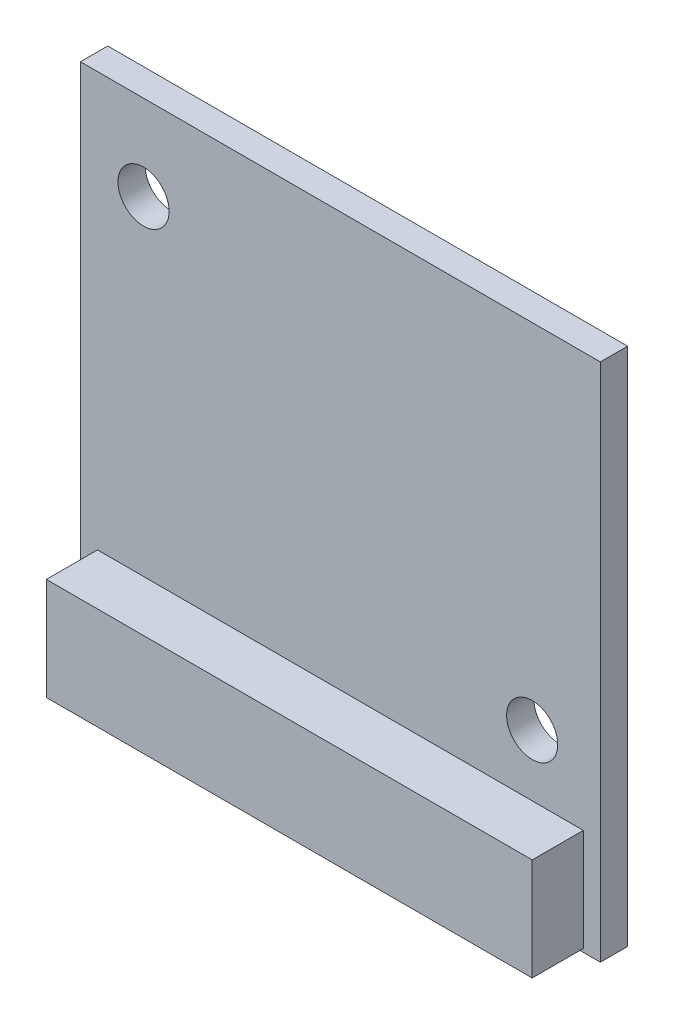
ISO-10303-21;
HEADER;
FILE_DESCRIPTION(('STEP AP214'),'2;1');
FILE_NAME('part.step','',(''),(''),'','','');
FILE_SCHEMA(('AUTOMOTIVE_DESIGN { 1 0 10303 214 1 1 1 1 }'));
ENDSEC;
DATA;
#1=APPLICATION_CONTEXT('core data for automotive mechanical design processes');
#2=APPLICATION_PROTOCOL_DEFINITION('international standard','automotive_design',2000,#1);
#3=PRODUCT_CONTEXT('',#1,'mechanical');
#4=PRODUCT('Part','Part','',(#3));
#5=PRODUCT_RELATED_PRODUCT_CATEGORY('part','',(#4));
#6=PRODUCT_DEFINITION_FORMATION('','',#4);
#7=PRODUCT_DEFINITION_CONTEXT('part definition',#1,'design');
#8=PRODUCT_DEFINITION('design','',#6,#7);
#9=PRODUCT_DEFINITION_SHAPE('','',#8);
#10=(LENGTH_UNIT() NAMED_UNIT(*) SI_UNIT(.MILLI.,.METRE.));
#11=(NAMED_UNIT(*) PLANE_ANGLE_UNIT() SI_UNIT($,.RADIAN.));
#12=(NAMED_UNIT(*) SI_UNIT($,.STERADIAN.) SOLID_ANGLE_UNIT());
#13=UNCERTAINTY_MEASURE_WITH_UNIT(LENGTH_MEASURE(1.E-05),#10,'distance_accuracy_value','');
#14=(GEOMETRIC_REPRESENTATION_CONTEXT(3) GLOBAL_UNCERTAINTY_ASSIGNED_CONTEXT((#13)) GLOBAL_UNIT_ASSIGNED_CONTEXT((#10,
#11,#12)) REPRESENTATION_CONTEXT('',''));
#15=CARTESIAN_POINT('',(0.,0.,0.));
#16=DIRECTION('',(0.,0.,1.));
#17=DIRECTION('',(1.,0.,0.));
#18=AXIS2_PLACEMENT_3D('',#15,#16,#17);
#19=CARTESIAN_POINT('',(0.,0.,1.6));
#20=DIRECTION('',(0.,0.,-1.));
#21=DIRECTION('',(-1.,0.,0.));
#22=AXIS2_PLACEMENT_3D('',#19,#20,#21);
#23=PLANE('',#22);
#24=CARTESIAN_POINT('',(26.5,9.8,1.6));
#25=DIRECTION('',(0.,0.,1.));
#26=DIRECTION('',(1.,0.,0.));
#27=AXIS2_PLACEMENT_3D('',#24,#25,#26);
#28=CIRCLE('',#27,1.5);
#29=CARTESIAN_POINT('',(28.,9.8,1.6));
#30=VERTEX_POINT('',#29);
#31=EDGE_CURVE('E130',#30,#30,#28,.T.);
#32=ORIENTED_EDGE('',*,*,#31,.F.);
#33=EDGE_LOOP('',(#32));
#34=FACE_BOUND('',#33,.T.);
#35=DIRECTION('',(0.,-1.,0.));
#36=VECTOR('',#35,1.);
#37=CARTESIAN_POINT('',(0.,0.,1.6));
#38=LINE('',#37,#36);
#39=CARTESIAN_POINT('',(0.,30.5,1.6));
#40=VERTEX_POINT('',#39);
#41=CARTESIAN_POINT('',(0.,0.,1.6));
#42=VERTEX_POINT('',#41);
#43=EDGE_CURVE('E137',#40,#42,#38,.T.);
#44=ORIENTED_EDGE('',*,*,#43,.T.);
#45=DIRECTION('',(1.,0.,0.));
#46=VECTOR('',#45,1.);
#47=CARTESIAN_POINT('',(0.,0.,1.6));
#48=LINE('',#47,#46);
#49=CARTESIAN_POINT('',(30.5,0.,1.6));
#50=VERTEX_POINT('',#49);
#51=EDGE_CURVE('E140',#42,#50,#48,.T.);
#52=ORIENTED_EDGE('',*,*,#51,.T.);
#53=DIRECTION('',(0.,1.,0.));
#54=VECTOR('',#53,1.);
#55=CARTESIAN_POINT('',(30.5,0.,1.6));
#56=LINE('',#55,#54);
#57=CARTESIAN_POINT('',(30.5,30.5,1.6));
#58=VERTEX_POINT('',#57);
#59=EDGE_CURVE('E143',#50,#58,#56,.T.);
#60=ORIENTED_EDGE('',*,*,#59,.T.);
#61=DIRECTION('',(-1.,0.,0.));
#62=VECTOR('',#61,1.);
#63=CARTESIAN_POINT('',(0.,30.5,1.6));
#64=LINE('',#63,#62);
#65=EDGE_CURVE('E145',#58,#40,#64,.T.);
#66=ORIENTED_EDGE('',*,*,#65,.T.);
#67=EDGE_LOOP('',(#44,#52,#60,#66));
#68=FACE_BOUND('',#67,.T.);
#69=CARTESIAN_POINT('',(3.7,25.5,1.6));
#70=DIRECTION('',(0.,0.,1.));
#71=DIRECTION('',(1.,0.,0.));
#72=AXIS2_PLACEMENT_3D('',#69,#70,#71);
#73=CIRCLE('',#72,1.5);
#74=CARTESIAN_POINT('',(5.2,25.5,1.6));
#75=VERTEX_POINT('',#74);
#76=EDGE_CURVE('E119',#75,#75,#73,.T.);
#77=ORIENTED_EDGE('',*,*,#76,.F.);
#78=EDGE_LOOP('',(#77));
#79=FACE_BOUND('',#78,.T.);
#80=DIRECTION('',(0.,-1.,0.));
#81=VECTOR('',#80,1.);
#82=CARTESIAN_POINT('',(1.,6.2,1.6));
#83=LINE('',#82,#81);
#84=CARTESIAN_POINT('',(1.,6.2,1.6));
#85=VERTEX_POINT('',#84);
#86=CARTESIAN_POINT('',(1.,0.2,1.6));
#87=VERTEX_POINT('',#86);
#88=EDGE_CURVE('E118',#85,#87,#83,.T.);
#89=ORIENTED_EDGE('',*,*,#88,.F.);
#90=DIRECTION('',(-1.,0.,0.));
#91=VECTOR('',#90,1.);
#92=CARTESIAN_POINT('',(1.,6.2,1.6));
#93=LINE('',#92,#91);
#94=CARTESIAN_POINT('',(29.5,6.2,1.6));
#95=VERTEX_POINT('',#94);
#96=EDGE_CURVE('E115',#95,#85,#93,.T.);
#97=ORIENTED_EDGE('',*,*,#96,.F.);
#98=DIRECTION('',(0.,1.,0.));
#99=VECTOR('',#98,1.);
#100=CARTESIAN_POINT('',(29.5,6.2,1.6));
#101=LINE('',#100,#99);
#102=CARTESIAN_POINT('',(29.5,0.2,1.6));
#103=VERTEX_POINT('',#102);
#104=EDGE_CURVE('E53',#103,#95,#101,.T.);
#105=ORIENTED_EDGE('',*,*,#104,.F.);
#106=DIRECTION('',(1.,0.,0.));
#107=VECTOR('',#106,1.);
#108=CARTESIAN_POINT('',(1.,0.2,1.6));
#109=LINE('',#108,#107);
#110=EDGE_CURVE('E48',#87,#103,#109,.T.);
#111=ORIENTED_EDGE('',*,*,#110,.F.);
#112=EDGE_LOOP('',(#89,#97,#105,#111));
#113=FACE_BOUND('',#112,.T.);
#114=ADVANCED_FACE('F33',(#34,#68,#79,#113),#23,.F.);
#115=CARTESIAN_POINT('',(0.,0.,1.6));
#116=DIRECTION('',(1.,0.,0.));
#117=DIRECTION('',(0.,0.,-1.));
#118=AXIS2_PLACEMENT_3D('',#115,#116,#117);
#119=PLANE('',#118);
#120=DIRECTION('',(0.,-1.,0.));
#121=VECTOR('',#120,1.);
#122=CARTESIAN_POINT('',(0.,0.,0.));
#123=LINE('',#122,#121);
#124=CARTESIAN_POINT('',(0.,30.5,0.));
#125=VERTEX_POINT('',#124);
#126=CARTESIAN_POINT('',(0.,0.,0.));
#127=VERTEX_POINT('',#126);
#128=EDGE_CURVE('E136',#125,#127,#123,.T.);
#129=ORIENTED_EDGE('',*,*,#128,.T.);
#130=DIRECTION('',(0.,0.,-1.));
#131=VECTOR('',#130,1.);
#132=CARTESIAN_POINT('',(0.,0.,1.6));
#133=LINE('',#132,#131);
#134=EDGE_CURVE('E11',#42,#127,#133,.T.);
#135=ORIENTED_EDGE('',*,*,#134,.F.);
#136=ORIENTED_EDGE('',*,*,#43,.F.);
#137=DIRECTION('',(0.,0.,-1.));
#138=VECTOR('',#137,1.);
#139=CARTESIAN_POINT('',(0.,30.5,1.6));
#140=LINE('',#139,#138);
#141=EDGE_CURVE('E147',#40,#125,#140,.T.);
#142=ORIENTED_EDGE('',*,*,#141,.T.);
#143=EDGE_LOOP('',(#129,#135,#136,#142));
#144=FACE_BOUND('',#143,.T.);
#145=ADVANCED_FACE('F35',(#144),#119,.F.);
#146=CARTESIAN_POINT('',(0.,0.,1.6));
#147=DIRECTION('',(0.,1.,0.));
#148=DIRECTION('',(0.,0.,1.));
#149=AXIS2_PLACEMENT_3D('',#146,#147,#148);
#150=PLANE('',#149);
#151=DIRECTION('',(1.,0.,0.));
#152=VECTOR('',#151,1.);
#153=CARTESIAN_POINT('',(0.,0.,0.));
#154=LINE('',#153,#152);
#155=CARTESIAN_POINT('',(30.5,0.,0.));
#156=VERTEX_POINT('',#155);
#157=EDGE_CURVE('E150',#127,#156,#154,.T.);
#158=ORIENTED_EDGE('',*,*,#157,.T.);
#159=DIRECTION('',(0.,0.,-1.));
#160=VECTOR('',#159,1.);
#161=CARTESIAN_POINT('',(30.5,0.,1.6));
#162=LINE('',#161,#160);
#163=EDGE_CURVE('E41',#50,#156,#162,.T.);
#164=ORIENTED_EDGE('',*,*,#163,.F.);
#165=ORIENTED_EDGE('',*,*,#51,.F.);
#166=ORIENTED_EDGE('',*,*,#134,.T.);
#167=EDGE_LOOP('',(#158,#164,#165,#166));
#168=FACE_BOUND('',#167,.T.);
#169=ADVANCED_FACE('F180',(#168),#150,.F.);
#170=CARTESIAN_POINT('',(30.5,0.,1.6));
#171=DIRECTION('',(-1.,0.,0.));
#172=DIRECTION('',(0.,0.,1.));
#173=AXIS2_PLACEMENT_3D('',#170,#171,#172);
#174=PLANE('',#173);
#175=DIRECTION('',(0.,1.,0.));
#176=VECTOR('',#175,1.);
#177=CARTESIAN_POINT('',(30.5,0.,0.));
#178=LINE('',#177,#176);
#179=CARTESIAN_POINT('',(30.5,30.5,0.));
#180=VERTEX_POINT('',#179);
#181=EDGE_CURVE('E152',#156,#180,#178,.T.);
#182=ORIENTED_EDGE('',*,*,#181,.T.);
#183=DIRECTION('',(0.,0.,-1.));
#184=VECTOR('',#183,1.);
#185=CARTESIAN_POINT('',(30.5,30.5,1.6));
#186=LINE('',#185,#184);
#187=EDGE_CURVE('E157',#58,#180,#186,.T.);
#188=ORIENTED_EDGE('',*,*,#187,.F.);
#189=ORIENTED_EDGE('',*,*,#59,.F.);
#190=ORIENTED_EDGE('',*,*,#163,.T.);
#191=EDGE_LOOP('',(#182,#188,#189,#190));
#192=FACE_BOUND('',#191,.T.);
#193=ADVANCED_FACE('F164',(#192),#174,.F.);
#194=CARTESIAN_POINT('',(0.,30.5,1.6));
#195=DIRECTION('',(0.,-1.,0.));
#196=DIRECTION('',(0.,0.,-1.));
#197=AXIS2_PLACEMENT_3D('',#194,#195,#196);
#198=PLANE('',#197);
#199=DIRECTION('',(-1.,0.,0.));
#200=VECTOR('',#199,1.);
#201=CARTESIAN_POINT('',(0.,30.5,0.));
#202=LINE('',#201,#200);
#203=EDGE_CURVE('E141',#180,#125,#202,.T.);
#204=ORIENTED_EDGE('',*,*,#203,.T.);
#205=ORIENTED_EDGE('',*,*,#141,.F.);
#206=ORIENTED_EDGE('',*,*,#65,.F.);
#207=ORIENTED_EDGE('',*,*,#187,.T.);
#208=EDGE_LOOP('',(#204,#205,#206,#207));
#209=FACE_BOUND('',#208,.T.);
#210=ADVANCED_FACE('F173',(#209),#198,.F.);
#211=CARTESIAN_POINT('',(0.,0.,0.));
#212=DIRECTION('',(0.,0.,-1.));
#213=DIRECTION('',(-1.,0.,0.));
#214=AXIS2_PLACEMENT_3D('',#211,#212,#213);
#215=PLANE('',#214);
#216=CARTESIAN_POINT('',(3.7,25.5,0.));
#217=DIRECTION('',(0.,0.,-1.));
#218=DIRECTION('',(-1.,0.,0.));
#219=AXIS2_PLACEMENT_3D('',#216,#217,#218);
#220=CIRCLE('',#219,1.5);
#221=CARTESIAN_POINT('',(2.2,25.5,0.));
#222=VERTEX_POINT('',#221);
#223=EDGE_CURVE('E122',#222,#222,#220,.T.);
#224=ORIENTED_EDGE('',*,*,#223,.F.);
#225=EDGE_LOOP('',(#224));
#226=FACE_BOUND('',#225,.T.);
#227=CARTESIAN_POINT('',(26.5,9.8,0.));
#228=DIRECTION('',(0.,0.,-1.));
#229=DIRECTION('',(-1.,0.,0.));
#230=AXIS2_PLACEMENT_3D('',#227,#228,#229);
#231=CIRCLE('',#230,1.5);
#232=CARTESIAN_POINT('',(25.,9.8,0.));
#233=VERTEX_POINT('',#232);
#234=EDGE_CURVE('E133',#233,#233,#231,.T.);
#235=ORIENTED_EDGE('',*,*,#234,.F.);
#236=EDGE_LOOP('',(#235));
#237=FACE_BOUND('',#236,.T.);
#238=ORIENTED_EDGE('',*,*,#128,.F.);
#239=ORIENTED_EDGE('',*,*,#203,.F.);
#240=ORIENTED_EDGE('',*,*,#181,.F.);
#241=ORIENTED_EDGE('',*,*,#157,.F.);
#242=EDGE_LOOP('',(#238,#239,#240,#241));
#243=FACE_BOUND('',#242,.T.);
#244=ADVANCED_FACE('F170',(#226,#237,#243),#215,.T.);
#245=CARTESIAN_POINT('',(26.5,9.8,1.6));
#246=DIRECTION('',(0.,0.,1.));
#247=DIRECTION('',(1.,0.,0.));
#248=AXIS2_PLACEMENT_3D('',#245,#246,#247);
#249=CYLINDRICAL_SURFACE('',#248,1.5);
#250=ORIENTED_EDGE('',*,*,#31,.T.);
#251=EDGE_LOOP('',(#250));
#252=FACE_BOUND('',#251,.T.);
#253=ORIENTED_EDGE('',*,*,#234,.T.);
#254=EDGE_LOOP('',(#253));
#255=FACE_BOUND('',#254,.T.);
#256=ADVANCED_FACE('F195',(#252,#255),#249,.F.);
#257=CARTESIAN_POINT('',(3.7,25.5,1.6));
#258=DIRECTION('',(0.,0.,1.));
#259=DIRECTION('',(1.,0.,0.));
#260=AXIS2_PLACEMENT_3D('',#257,#258,#259);
#261=CYLINDRICAL_SURFACE('',#260,1.5);
#262=ORIENTED_EDGE('',*,*,#76,.T.);
#263=EDGE_LOOP('',(#262));
#264=FACE_BOUND('',#263,.T.);
#265=ORIENTED_EDGE('',*,*,#223,.T.);
#266=EDGE_LOOP('',(#265));
#267=FACE_BOUND('',#266,.T.);
#268=ADVANCED_FACE('F215',(#264,#267),#261,.F.);
#269=CARTESIAN_POINT('',(1.,6.2,4.6));
#270=DIRECTION('',(1.,0.,0.));
#271=DIRECTION('',(0.,1.,0.));
#272=AXIS2_PLACEMENT_3D('',#269,#270,#271);
#273=PLANE('',#272);
#274=ORIENTED_EDGE('',*,*,#88,.T.);
#275=DIRECTION('',(0.,0.,-1.));
#276=VECTOR('',#275,1.);
#277=CARTESIAN_POINT('',(1.,0.2,4.6));
#278=LINE('',#277,#276);
#279=CARTESIAN_POINT('',(1.,0.2,4.6));
#280=VERTEX_POINT('',#279);
#281=EDGE_CURVE('E99',#280,#87,#278,.T.);
#282=ORIENTED_EDGE('',*,*,#281,.F.);
#283=DIRECTION('',(0.,-1.,0.));
#284=VECTOR('',#283,1.);
#285=CARTESIAN_POINT('',(1.,6.2,4.6));
#286=LINE('',#285,#284);
#287=CARTESIAN_POINT('',(1.,6.2,4.6));
#288=VERTEX_POINT('',#287);
#289=EDGE_CURVE('E106',#288,#280,#286,.T.);
#290=ORIENTED_EDGE('',*,*,#289,.F.);
#291=DIRECTION('',(0.,0.,-1.));
#292=VECTOR('',#291,1.);
#293=CARTESIAN_POINT('',(1.,6.2,4.6));
#294=LINE('',#293,#292);
#295=EDGE_CURVE('E296',#288,#85,#294,.T.);
#296=ORIENTED_EDGE('',*,*,#295,.T.);
#297=EDGE_LOOP('',(#274,#282,#290,#296));
#298=FACE_BOUND('',#297,.T.);
#299=ADVANCED_FACE('F117',(#298),#273,.F.);
#300=CARTESIAN_POINT('',(1.,0.2,4.6));
#301=DIRECTION('',(0.,1.,0.));
#302=DIRECTION('',(0.,0.,1.));
#303=AXIS2_PLACEMENT_3D('',#300,#301,#302);
#304=PLANE('',#303);
#305=ORIENTED_EDGE('',*,*,#110,.T.);
#306=DIRECTION('',(0.,0.,-1.));
#307=VECTOR('',#306,1.);
#308=CARTESIAN_POINT('',(29.5,0.2,4.6));
#309=LINE('',#308,#307);
#310=CARTESIAN_POINT('',(29.5,0.2,4.6));
#311=VERTEX_POINT('',#310);
#312=EDGE_CURVE('E102',#311,#103,#309,.T.);
#313=ORIENTED_EDGE('',*,*,#312,.F.);
#314=DIRECTION('',(1.,0.,0.));
#315=VECTOR('',#314,1.);
#316=CARTESIAN_POINT('',(1.,0.2,4.6));
#317=LINE('',#316,#315);
#318=EDGE_CURVE('E95',#280,#311,#317,.T.);
#319=ORIENTED_EDGE('',*,*,#318,.F.);
#320=ORIENTED_EDGE('',*,*,#281,.T.);
#321=EDGE_LOOP('',(#305,#313,#319,#320));
#322=FACE_BOUND('',#321,.T.);
#323=ADVANCED_FACE('F97',(#322),#304,.F.);
#324=CARTESIAN_POINT('',(29.5,6.2,4.6));
#325=DIRECTION('',(-1.,0.,0.));
#326=DIRECTION('',(0.,0.,1.));
#327=AXIS2_PLACEMENT_3D('',#324,#325,#326);
#328=PLANE('',#327);
#329=ORIENTED_EDGE('',*,*,#104,.T.);
#330=DIRECTION('',(0.,0.,-1.));
#331=VECTOR('',#330,1.);
#332=CARTESIAN_POINT('',(29.5,6.2,4.6));
#333=LINE('',#332,#331);
#334=CARTESIAN_POINT('',(29.5,6.2,4.6));
#335=VERTEX_POINT('',#334);
#336=EDGE_CURVE('E124',#335,#95,#333,.T.);
#337=ORIENTED_EDGE('',*,*,#336,.F.);
#338=DIRECTION('',(0.,1.,0.));
#339=VECTOR('',#338,1.);
#340=CARTESIAN_POINT('',(29.5,6.2,4.6));
#341=LINE('',#340,#339);
#342=EDGE_CURVE('E105',#311,#335,#341,.T.);
#343=ORIENTED_EDGE('',*,*,#342,.F.);
#344=ORIENTED_EDGE('',*,*,#312,.T.);
#345=EDGE_LOOP('',(#329,#337,#343,#344));
#346=FACE_BOUND('',#345,.T.);
#347=ADVANCED_FACE('F234',(#346),#328,.F.);
#348=CARTESIAN_POINT('',(1.,6.2,4.6));
#349=DIRECTION('',(0.,-1.,0.));
#350=DIRECTION('',(0.,0.,-1.));
#351=AXIS2_PLACEMENT_3D('',#348,#349,#350);
#352=PLANE('',#351);
#353=ORIENTED_EDGE('',*,*,#96,.T.);
#354=ORIENTED_EDGE('',*,*,#295,.F.);
#355=DIRECTION('',(-1.,0.,0.));
#356=VECTOR('',#355,1.);
#357=CARTESIAN_POINT('',(1.,6.2,4.6));
#358=LINE('',#357,#356);
#359=EDGE_CURVE('E111',#335,#288,#358,.T.);
#360=ORIENTED_EDGE('',*,*,#359,.F.);
#361=ORIENTED_EDGE('',*,*,#336,.T.);
#362=EDGE_LOOP('',(#353,#354,#360,#361));
#363=FACE_BOUND('',#362,.T.);
#364=ADVANCED_FACE('F241',(#363),#352,.F.);
#365=CARTESIAN_POINT('',(0.,0.,4.6));
#366=DIRECTION('',(0.,0.,1.));
#367=DIRECTION('',(1.,0.,0.));
#368=AXIS2_PLACEMENT_3D('',#365,#366,#367);
#369=PLANE('',#368);
#370=ORIENTED_EDGE('',*,*,#289,.T.);
#371=ORIENTED_EDGE('',*,*,#318,.T.);
#372=ORIENTED_EDGE('',*,*,#342,.T.);
#373=ORIENTED_EDGE('',*,*,#359,.T.);
#374=EDGE_LOOP('',(#370,#371,#372,#373));
#375=FACE_BOUND('',#374,.T.);
#376=ADVANCED_FACE('F109',(#375),#369,.T.);
#377=CLOSED_SHELL('',(#114,#145,#169,#193,#210,#244,#256,#268,#299,#323,#347,#364,#376));
#378=MANIFOLD_SOLID_BREP('B2',#377);
#379=ADVANCED_BREP_SHAPE_REPRESENTATION('',(#18,#378),#14);
#380=SHAPE_DEFINITION_REPRESENTATION(#9,#379);
ENDSEC;
END-ISO-10303-21;
